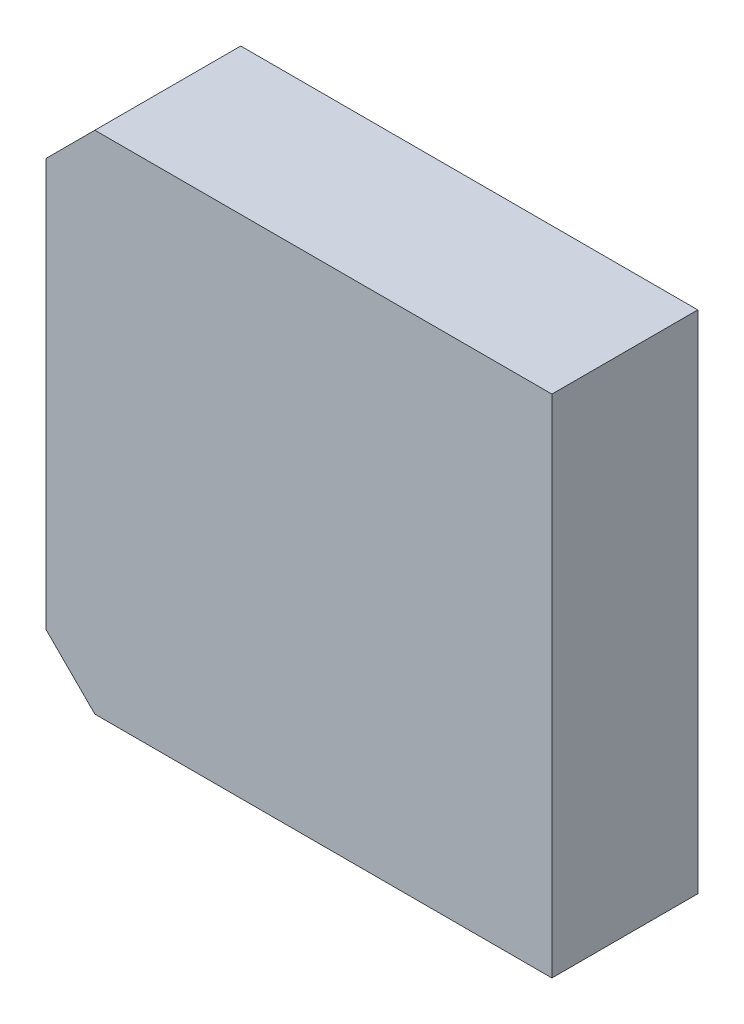
ISO-10303-21;
HEADER;
FILE_DESCRIPTION(('STEP AP214'),'2;1');
FILE_NAME('part.step','',(''),(''),'','','');
FILE_SCHEMA(('AUTOMOTIVE_DESIGN { 1 0 10303 214 1 1 1 1 }'));
ENDSEC;
DATA;
#1=APPLICATION_CONTEXT('core data for automotive mechanical design processes');
#2=APPLICATION_PROTOCOL_DEFINITION('international standard','automotive_design',2000,#1);
#3=PRODUCT_CONTEXT('',#1,'mechanical');
#4=PRODUCT('Part','Part','',(#3));
#5=PRODUCT_RELATED_PRODUCT_CATEGORY('part','',(#4));
#6=PRODUCT_DEFINITION_FORMATION('','',#4);
#7=PRODUCT_DEFINITION_CONTEXT('part definition',#1,'design');
#8=PRODUCT_DEFINITION('design','',#6,#7);
#9=PRODUCT_DEFINITION_SHAPE('','',#8);
#10=(LENGTH_UNIT() NAMED_UNIT(*) SI_UNIT(.MILLI.,.METRE.));
#11=(NAMED_UNIT(*) PLANE_ANGLE_UNIT() SI_UNIT($,.RADIAN.));
#12=(NAMED_UNIT(*) SI_UNIT($,.STERADIAN.) SOLID_ANGLE_UNIT());
#13=UNCERTAINTY_MEASURE_WITH_UNIT(LENGTH_MEASURE(1.E-05),#10,'distance_accuracy_value','');
#14=(GEOMETRIC_REPRESENTATION_CONTEXT(3) GLOBAL_UNCERTAINTY_ASSIGNED_CONTEXT((#13)) GLOBAL_UNIT_ASSIGNED_CONTEXT((#10,
#11,#12)) REPRESENTATION_CONTEXT('',''));
#15=CARTESIAN_POINT('',(0.,0.,0.));
#16=DIRECTION('',(0.,0.,1.));
#17=DIRECTION('',(1.,0.,0.));
#18=AXIS2_PLACEMENT_3D('',#15,#16,#17);
#19=CARTESIAN_POINT('',(-4.19999922,5.19999976,0.));
#20=DIRECTION('',(0.707106781186548,-0.707106781186548,0.));
#21=DIRECTION('',(0.707106781186548,0.707106781186548,0.));
#22=AXIS2_PLACEMENT_3D('',#19,#20,#21);
#23=PLANE('',#22);
#24=DIRECTION('',(0.,0.,-1.));
#25=VECTOR('',#24,1.);
#26=CARTESIAN_POINT('',(-5.19999976,4.19999922,0.));
#27=LINE('',#26,#25);
#28=CARTESIAN_POINT('',(-5.19999976,4.19999922,0.));
#29=VERTEX_POINT('',#28);
#30=CARTESIAN_POINT('',(-5.19999976,4.19999922,2.99999908));
#31=VERTEX_POINT('',#30);
#32=EDGE_CURVE('E73',#29,#31,#27,.F.);
#33=ORIENTED_EDGE('',*,*,#32,.T.);
#34=DIRECTION('',(0.707106781186548,0.707106781186548,0.));
#35=VECTOR('',#34,1.);
#36=CARTESIAN_POINT('',(-5.19999976,4.19999922,2.99999908));
#37=LINE('',#36,#35);
#38=CARTESIAN_POINT('',(-4.19999922,5.19999976,2.99999908));
#39=VERTEX_POINT('',#38);
#40=EDGE_CURVE('E69',#31,#39,#37,.T.);
#41=ORIENTED_EDGE('',*,*,#40,.T.);
#42=DIRECTION('',(0.,0.,-1.));
#43=VECTOR('',#42,1.);
#44=CARTESIAN_POINT('',(-4.19999922,5.19999976,0.));
#45=LINE('',#44,#43);
#46=CARTESIAN_POINT('',(-4.19999922,5.19999976,0.));
#47=VERTEX_POINT('',#46);
#48=EDGE_CURVE('E71',#39,#47,#45,.T.);
#49=ORIENTED_EDGE('',*,*,#48,.T.);
#50=DIRECTION('',(0.707106781186548,0.707106781186548,0.));
#51=VECTOR('',#50,1.);
#52=CARTESIAN_POINT('',(-4.19999922,5.19999976,0.));
#53=LINE('',#52,#51);
#54=EDGE_CURVE('E20',#29,#47,#53,.T.);
#55=ORIENTED_EDGE('',*,*,#54,.F.);
#56=EDGE_LOOP('',(#33,#41,#49,#55));
#57=FACE_BOUND('',#56,.T.);
#58=ADVANCED_FACE('F17',(#57),#23,.F.);
#59=CARTESIAN_POINT('',(-4.19999922,5.19999976,2.99999908));
#60=DIRECTION('',(0.,0.,-1.));
#61=DIRECTION('',(-1.,0.,0.));
#62=AXIS2_PLACEMENT_3D('',#59,#60,#61);
#63=PLANE('',#62);
#64=DIRECTION('',(0.,1.,0.));
#65=VECTOR('',#64,1.);
#66=CARTESIAN_POINT('',(-5.19999976,4.19999922,2.99999908));
#67=LINE('',#66,#65);
#68=CARTESIAN_POINT('',(-5.19999976,-4.19999922,2.99999908));
#69=VERTEX_POINT('',#68);
#70=EDGE_CURVE('E95',#31,#69,#67,.F.);
#71=ORIENTED_EDGE('',*,*,#70,.T.);
#72=DIRECTION('',(-0.707106781186548,0.707106781186548,0.));
#73=VECTOR('',#72,1.);
#74=CARTESIAN_POINT('',(-5.19999976,-4.19999922,2.99999908));
#75=LINE('',#74,#73);
#76=CARTESIAN_POINT('',(-4.19999922,-5.19999976,2.99999908));
#77=VERTEX_POINT('',#76);
#78=EDGE_CURVE('E75',#69,#77,#75,.F.);
#79=ORIENTED_EDGE('',*,*,#78,.T.);
#80=DIRECTION('',(1.,0.,0.));
#81=VECTOR('',#80,1.);
#82=CARTESIAN_POINT('',(-4.19999922,-5.19999976,2.99999908));
#83=LINE('',#82,#81);
#84=CARTESIAN_POINT('',(5.19999976,-5.19999976,2.99999908));
#85=VERTEX_POINT('',#84);
#86=EDGE_CURVE('E94',#77,#85,#83,.T.);
#87=ORIENTED_EDGE('',*,*,#86,.T.);
#88=DIRECTION('',(0.,1.,0.));
#89=VECTOR('',#88,1.);
#90=CARTESIAN_POINT('',(5.19999976,-5.19999976,2.99999908));
#91=LINE('',#90,#89);
#92=CARTESIAN_POINT('',(5.19999976,5.19999976,2.99999908));
#93=VERTEX_POINT('',#92);
#94=EDGE_CURVE('E65',#85,#93,#91,.T.);
#95=ORIENTED_EDGE('',*,*,#94,.T.);
#96=DIRECTION('',(1.,0.,0.));
#97=VECTOR('',#96,1.);
#98=CARTESIAN_POINT('',(5.19999976,5.19999976,2.99999908));
#99=LINE('',#98,#97);
#100=EDGE_CURVE('E76',#93,#39,#99,.F.);
#101=ORIENTED_EDGE('',*,*,#100,.T.);
#102=ORIENTED_EDGE('',*,*,#40,.F.);
#103=EDGE_LOOP('',(#71,#79,#87,#95,#101,#102));
#104=FACE_BOUND('',#103,.T.);
#105=ADVANCED_FACE('F77',(#104),#63,.F.);
#106=CARTESIAN_POINT('',(-5.19999976,-4.19999922,0.));
#107=DIRECTION('',(0.707106781186548,0.707106781186548,0.));
#108=DIRECTION('',(-0.707106781186548,0.707106781186548,0.));
#109=AXIS2_PLACEMENT_3D('',#106,#107,#108);
#110=PLANE('',#109);
#111=DIRECTION('',(0.,0.,1.));
#112=VECTOR('',#111,1.);
#113=CARTESIAN_POINT('',(-4.19999922,-5.19999976,0.));
#114=LINE('',#113,#112);
#115=CARTESIAN_POINT('',(-4.19999922,-5.19999976,0.));
#116=VERTEX_POINT('',#115);
#117=EDGE_CURVE('E100',#116,#77,#114,.T.);
#118=ORIENTED_EDGE('',*,*,#117,.T.);
#119=ORIENTED_EDGE('',*,*,#78,.F.);
#120=DIRECTION('',(0.,0.,-1.));
#121=VECTOR('',#120,1.);
#122=CARTESIAN_POINT('',(-5.19999976,-4.19999922,0.));
#123=LINE('',#122,#121);
#124=CARTESIAN_POINT('',(-5.19999976,-4.19999922,0.));
#125=VERTEX_POINT('',#124);
#126=EDGE_CURVE('E120',#69,#125,#123,.T.);
#127=ORIENTED_EDGE('',*,*,#126,.T.);
#128=DIRECTION('',(-0.707106781186548,0.707106781186548,0.));
#129=VECTOR('',#128,1.);
#130=CARTESIAN_POINT('',(-5.19999976,-4.19999922,0.));
#131=LINE('',#130,#129);
#132=EDGE_CURVE('E80',#116,#125,#131,.T.);
#133=ORIENTED_EDGE('',*,*,#132,.F.);
#134=EDGE_LOOP('',(#118,#119,#127,#133));
#135=FACE_BOUND('',#134,.T.);
#136=ADVANCED_FACE('F101',(#135),#110,.F.);
#137=CARTESIAN_POINT('',(5.19999976,5.19999976,0.));
#138=DIRECTION('',(0.,-1.,0.));
#139=DIRECTION('',(0.,0.,-1.));
#140=AXIS2_PLACEMENT_3D('',#137,#138,#139);
#141=PLANE('',#140);
#142=ORIENTED_EDGE('',*,*,#48,.F.);
#143=ORIENTED_EDGE('',*,*,#100,.F.);
#144=DIRECTION('',(0.,0.,1.));
#145=VECTOR('',#144,1.);
#146=CARTESIAN_POINT('',(5.19999976,5.19999976,0.));
#147=LINE('',#146,#145);
#148=CARTESIAN_POINT('',(5.19999976,5.19999976,0.));
#149=VERTEX_POINT('',#148);
#150=EDGE_CURVE('E86',#93,#149,#147,.F.);
#151=ORIENTED_EDGE('',*,*,#150,.T.);
#152=DIRECTION('',(-1.,0.,0.));
#153=VECTOR('',#152,1.);
#154=CARTESIAN_POINT('',(-4.19999922,5.19999976,0.));
#155=LINE('',#154,#153);
#156=EDGE_CURVE('E84',#47,#149,#155,.F.);
#157=ORIENTED_EDGE('',*,*,#156,.F.);
#158=EDGE_LOOP('',(#142,#143,#151,#157));
#159=FACE_BOUND('',#158,.T.);
#160=ADVANCED_FACE('F82',(#159),#141,.F.);
#161=CARTESIAN_POINT('',(5.19999976,-5.19999976,0.));
#162=DIRECTION('',(-1.,0.,0.));
#163=DIRECTION('',(0.,0.,1.));
#164=AXIS2_PLACEMENT_3D('',#161,#162,#163);
#165=PLANE('',#164);
#166=ORIENTED_EDGE('',*,*,#150,.F.);
#167=ORIENTED_EDGE('',*,*,#94,.F.);
#168=DIRECTION('',(0.,0.,1.));
#169=VECTOR('',#168,1.);
#170=CARTESIAN_POINT('',(5.19999976,-5.19999976,0.));
#171=LINE('',#170,#169);
#172=CARTESIAN_POINT('',(5.19999976,-5.19999976,0.));
#173=VERTEX_POINT('',#172);
#174=EDGE_CURVE('E108',#85,#173,#171,.F.);
#175=ORIENTED_EDGE('',*,*,#174,.T.);
#176=DIRECTION('',(0.,1.,0.));
#177=VECTOR('',#176,1.);
#178=CARTESIAN_POINT('',(5.19999976,5.19999976,0.));
#179=LINE('',#178,#177);
#180=EDGE_CURVE('E115',#149,#173,#179,.F.);
#181=ORIENTED_EDGE('',*,*,#180,.F.);
#182=EDGE_LOOP('',(#166,#167,#175,#181));
#183=FACE_BOUND('',#182,.T.);
#184=ADVANCED_FACE('F116',(#183),#165,.F.);
#185=CARTESIAN_POINT('',(-4.19999922,-5.19999976,0.));
#186=DIRECTION('',(0.,1.,0.));
#187=DIRECTION('',(0.,0.,1.));
#188=AXIS2_PLACEMENT_3D('',#185,#186,#187);
#189=PLANE('',#188);
#190=ORIENTED_EDGE('',*,*,#174,.F.);
#191=ORIENTED_EDGE('',*,*,#86,.F.);
#192=ORIENTED_EDGE('',*,*,#117,.F.);
#193=DIRECTION('',(-1.,0.,0.));
#194=VECTOR('',#193,1.);
#195=CARTESIAN_POINT('',(-4.19999922,-5.19999976,0.));
#196=LINE('',#195,#194);
#197=EDGE_CURVE('E26',#173,#116,#196,.T.);
#198=ORIENTED_EDGE('',*,*,#197,.F.);
#199=EDGE_LOOP('',(#190,#191,#192,#198));
#200=FACE_BOUND('',#199,.T.);
#201=ADVANCED_FACE('F107',(#200),#189,.F.);
#202=CARTESIAN_POINT('',(-5.19999976,4.19999922,0.));
#203=DIRECTION('',(1.,0.,0.));
#204=DIRECTION('',(0.,0.,-1.));
#205=AXIS2_PLACEMENT_3D('',#202,#203,#204);
#206=PLANE('',#205);
#207=ORIENTED_EDGE('',*,*,#126,.F.);
#208=ORIENTED_EDGE('',*,*,#70,.F.);
#209=ORIENTED_EDGE('',*,*,#32,.F.);
#210=DIRECTION('',(0.,1.,0.));
#211=VECTOR('',#210,1.);
#212=CARTESIAN_POINT('',(-5.19999976,5.19999976,0.));
#213=LINE('',#212,#211);
#214=EDGE_CURVE('E11',#125,#29,#213,.T.);
#215=ORIENTED_EDGE('',*,*,#214,.F.);
#216=EDGE_LOOP('',(#207,#208,#209,#215));
#217=FACE_BOUND('',#216,.T.);
#218=ADVANCED_FACE('F127',(#217),#206,.F.);
#219=CARTESIAN_POINT('',(-4.19999922,5.19999976,0.));
#220=DIRECTION('',(0.,0.,-1.));
#221=DIRECTION('',(-1.,0.,0.));
#222=AXIS2_PLACEMENT_3D('',#219,#220,#221);
#223=PLANE('',#222);
#224=ORIENTED_EDGE('',*,*,#214,.T.);
#225=ORIENTED_EDGE('',*,*,#54,.T.);
#226=ORIENTED_EDGE('',*,*,#156,.T.);
#227=ORIENTED_EDGE('',*,*,#180,.T.);
#228=ORIENTED_EDGE('',*,*,#197,.T.);
#229=ORIENTED_EDGE('',*,*,#132,.T.);
#230=EDGE_LOOP('',(#224,#225,#226,#227,#228,#229));
#231=FACE_BOUND('',#230,.T.);
#232=ADVANCED_FACE('F119',(#231),#223,.T.);
#233=CLOSED_SHELL('',(#58,#105,#136,#160,#184,#201,#218,#232));
#234=MANIFOLD_SOLID_BREP('B1',#233);
#235=ADVANCED_BREP_SHAPE_REPRESENTATION('',(#18,#234),#14);
#236=SHAPE_DEFINITION_REPRESENTATION(#9,#235);
ENDSEC;
END-ISO-10303-21;
